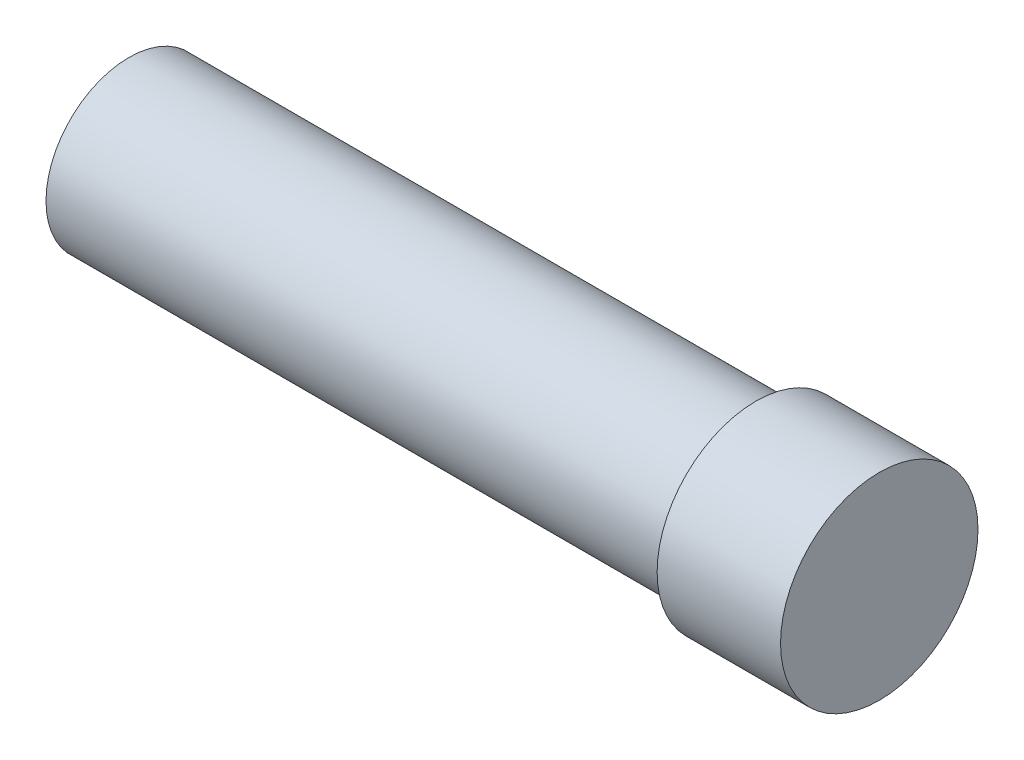
ISO-10303-21;
HEADER;
FILE_DESCRIPTION(('STEP AP214'),'2;1');
FILE_NAME('part.step','',(''),(''),'','','');
FILE_SCHEMA(('AUTOMOTIVE_DESIGN { 1 0 10303 214 1 1 1 1 }'));
ENDSEC;
DATA;
#1=APPLICATION_CONTEXT('core data for automotive mechanical design processes');
#2=APPLICATION_PROTOCOL_DEFINITION('international standard','automotive_design',2000,#1);
#3=PRODUCT_CONTEXT('',#1,'mechanical');
#4=PRODUCT('Part','Part','',(#3));
#5=PRODUCT_RELATED_PRODUCT_CATEGORY('part','',(#4));
#6=PRODUCT_DEFINITION_FORMATION('','',#4);
#7=PRODUCT_DEFINITION_CONTEXT('part definition',#1,'design');
#8=PRODUCT_DEFINITION('design','',#6,#7);
#9=PRODUCT_DEFINITION_SHAPE('','',#8);
#10=(LENGTH_UNIT() NAMED_UNIT(*) SI_UNIT(.MILLI.,.METRE.));
#11=(NAMED_UNIT(*) PLANE_ANGLE_UNIT() SI_UNIT($,.RADIAN.));
#12=(NAMED_UNIT(*) SI_UNIT($,.STERADIAN.) SOLID_ANGLE_UNIT());
#13=UNCERTAINTY_MEASURE_WITH_UNIT(LENGTH_MEASURE(1.E-05),#10,'distance_accuracy_value','');
#14=(GEOMETRIC_REPRESENTATION_CONTEXT(3) GLOBAL_UNCERTAINTY_ASSIGNED_CONTEXT((#13)) GLOBAL_UNIT_ASSIGNED_CONTEXT((#10,
#11,#12)) REPRESENTATION_CONTEXT('',''));
#15=CARTESIAN_POINT('',(0.,0.,0.));
#16=DIRECTION('',(0.,0.,1.));
#17=DIRECTION('',(1.,0.,0.));
#18=AXIS2_PLACEMENT_3D('',#15,#16,#17);
#19=CARTESIAN_POINT('',(0.,0.,0.));
#20=DIRECTION('',(1.,0.,0.));
#21=DIRECTION('',(0.,0.,-1.));
#22=AXIS2_PLACEMENT_3D('',#19,#20,#21);
#23=PLANE('',#22);
#24=CARTESIAN_POINT('',(0.,0.,0.));
#25=DIRECTION('',(1.,0.,0.));
#26=DIRECTION('',(0.,0.,-1.));
#27=AXIS2_PLACEMENT_3D('',#24,#25,#26);
#28=CIRCLE('',#27,5.08);
#29=CARTESIAN_POINT('',(0.,0.,-5.08));
#30=VERTEX_POINT('',#29);
#31=EDGE_CURVE('E44',#30,#30,#28,.T.);
#32=ORIENTED_EDGE('',*,*,#31,.F.);
#33=EDGE_LOOP('',(#32));
#34=FACE_BOUND('',#33,.T.);
#35=CARTESIAN_POINT('',(0.,0.,0.));
#36=DIRECTION('',(1.,0.,0.));
#37=DIRECTION('',(0.,0.,-1.));
#38=AXIS2_PLACEMENT_3D('',#35,#36,#37);
#39=CIRCLE('',#38,4.2672);
#40=CARTESIAN_POINT('',(0.,0.,-4.2672));
#41=VERTEX_POINT('',#40);
#42=EDGE_CURVE('E10',#41,#41,#39,.F.);
#43=ORIENTED_EDGE('',*,*,#42,.F.);
#44=EDGE_LOOP('',(#43));
#45=FACE_BOUND('',#44,.T.);
#46=ADVANCED_FACE('F33',(#34,#45),#23,.F.);
#47=CARTESIAN_POINT('',(6.35,0.,0.));
#48=DIRECTION('',(-1.,0.,0.));
#49=DIRECTION('',(0.,0.,1.));
#50=AXIS2_PLACEMENT_3D('',#47,#48,#49);
#51=CYLINDRICAL_SURFACE('',#50,5.08);
#52=CARTESIAN_POINT('',(6.35,0.,0.));
#53=DIRECTION('',(1.,0.,0.));
#54=DIRECTION('',(0.,0.,-1.));
#55=AXIS2_PLACEMENT_3D('',#52,#53,#54);
#56=CIRCLE('',#55,5.08);
#57=CARTESIAN_POINT('',(6.35,0.,-5.08));
#58=VERTEX_POINT('',#57);
#59=EDGE_CURVE('E40',#58,#58,#56,.T.);
#60=ORIENTED_EDGE('',*,*,#59,.F.);
#61=EDGE_LOOP('',(#60));
#62=FACE_BOUND('',#61,.T.);
#63=ORIENTED_EDGE('',*,*,#31,.T.);
#64=EDGE_LOOP('',(#63));
#65=FACE_BOUND('',#64,.T.);
#66=ADVANCED_FACE('F35',(#62,#65),#51,.T.);
#67=CARTESIAN_POINT('',(6.35,0.,0.));
#68=DIRECTION('',(1.,0.,0.));
#69=DIRECTION('',(0.,0.,-1.));
#70=AXIS2_PLACEMENT_3D('',#67,#68,#69);
#71=PLANE('',#70);
#72=ORIENTED_EDGE('',*,*,#59,.T.);
#73=EDGE_LOOP('',(#72));
#74=FACE_BOUND('',#73,.T.);
#75=ADVANCED_FACE('F71',(#74),#71,.T.);
#76=CARTESIAN_POINT('',(-32.258,0.,0.));
#77=DIRECTION('',(1.,0.,0.));
#78=DIRECTION('',(0.,0.,-1.));
#79=AXIS2_PLACEMENT_3D('',#76,#77,#78);
#80=CYLINDRICAL_SURFACE('',#79,4.2672);
#81=CARTESIAN_POINT('',(-32.258,0.,0.));
#82=DIRECTION('',(-1.,0.,0.));
#83=DIRECTION('',(0.,0.,1.));
#84=AXIS2_PLACEMENT_3D('',#81,#82,#83);
#85=CIRCLE('',#84,4.2672);
#86=CARTESIAN_POINT('',(-32.258,0.,4.2672));
#87=VERTEX_POINT('',#86);
#88=EDGE_CURVE('E49',#87,#87,#85,.T.);
#89=ORIENTED_EDGE('',*,*,#88,.F.);
#90=EDGE_LOOP('',(#89));
#91=FACE_BOUND('',#90,.T.);
#92=ORIENTED_EDGE('',*,*,#42,.T.);
#93=EDGE_LOOP('',(#92));
#94=FACE_BOUND('',#93,.T.);
#95=ADVANCED_FACE('F66',(#91,#94),#80,.T.);
#96=CARTESIAN_POINT('',(-32.258,0.,0.));
#97=DIRECTION('',(-1.,0.,0.));
#98=DIRECTION('',(0.,0.,1.));
#99=AXIS2_PLACEMENT_3D('',#96,#97,#98);
#100=PLANE('',#99);
#101=CARTESIAN_POINT('',(-32.258,0.,0.));
#102=DIRECTION('',(-1.,0.,0.));
#103=DIRECTION('',(0.,0.,1.));
#104=AXIS2_PLACEMENT_3D('',#101,#102,#103);
#105=CIRCLE('',#104,1.999999937);
#106=CARTESIAN_POINT('',(-32.258,0.,1.999999937));
#107=VERTEX_POINT('',#106);
#108=EDGE_CURVE('E56',#107,#107,#105,.T.);
#109=ORIENTED_EDGE('',*,*,#108,.F.);
#110=EDGE_LOOP('',(#109));
#111=FACE_BOUND('',#110,.T.);
#112=ORIENTED_EDGE('',*,*,#88,.T.);
#113=EDGE_LOOP('',(#112));
#114=FACE_BOUND('',#113,.T.);
#115=ADVANCED_FACE('F62',(#111,#114),#100,.T.);
#116=CARTESIAN_POINT('',(-19.558,0.,0.));
#117=DIRECTION('',(1.,0.,0.));
#118=DIRECTION('',(0.,0.,-1.));
#119=AXIS2_PLACEMENT_3D('',#116,#117,#118);
#120=PLANE('',#119);
#121=CARTESIAN_POINT('',(-19.558,0.,0.));
#122=DIRECTION('',(-1.,0.,0.));
#123=DIRECTION('',(0.,0.,1.));
#124=AXIS2_PLACEMENT_3D('',#121,#122,#123);
#125=CIRCLE('',#124,1.999999937);
#126=CARTESIAN_POINT('',(-19.558,0.,1.999999937));
#127=VERTEX_POINT('',#126);
#128=EDGE_CURVE('E53',#127,#127,#125,.T.);
#129=ORIENTED_EDGE('',*,*,#128,.T.);
#130=EDGE_LOOP('',(#129));
#131=FACE_BOUND('',#130,.T.);
#132=ADVANCED_FACE('F65',(#131),#120,.F.);
#133=CARTESIAN_POINT('',(-32.258,0.,0.));
#134=DIRECTION('',(-1.,0.,0.));
#135=DIRECTION('',(0.,0.,1.));
#136=AXIS2_PLACEMENT_3D('',#133,#134,#135);
#137=CYLINDRICAL_SURFACE('',#136,1.999999937);
#138=ORIENTED_EDGE('',*,*,#128,.F.);
#139=EDGE_LOOP('',(#138));
#140=FACE_BOUND('',#139,.T.);
#141=ORIENTED_EDGE('',*,*,#108,.T.);
#142=EDGE_LOOP('',(#141));
#143=FACE_BOUND('',#142,.T.);
#144=ADVANCED_FACE('F60',(#140,#143),#137,.F.);
#145=CLOSED_SHELL('',(#46,#66,#75,#95,#115,#132,#144));
#146=MANIFOLD_SOLID_BREP('B2',#145);
#147=ADVANCED_BREP_SHAPE_REPRESENTATION('',(#18,#146),#14);
#148=SHAPE_DEFINITION_REPRESENTATION(#9,#147);
ENDSEC;
END-ISO-10303-21;
